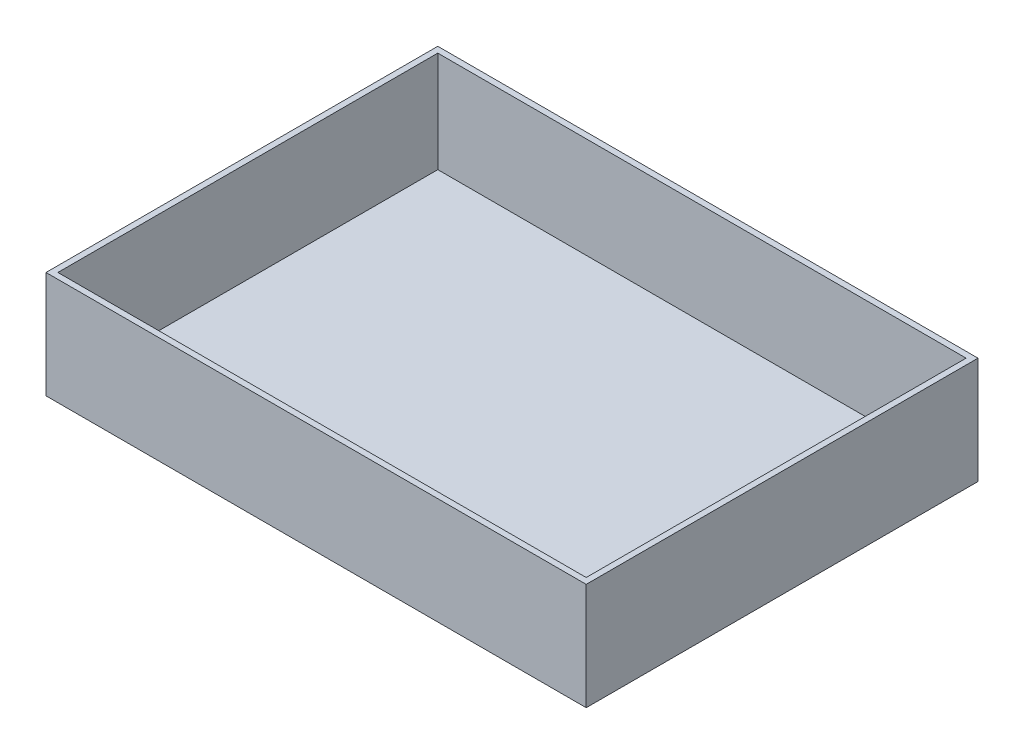
ISO-10303-21;
HEADER;
FILE_DESCRIPTION(('STEP AP214'),'2;1');
FILE_NAME('part.step','',(''),(''),'','','');
FILE_SCHEMA(('AUTOMOTIVE_DESIGN { 1 0 10303 214 1 1 1 1 }'));
ENDSEC;
DATA;
#1=APPLICATION_CONTEXT('core data for automotive mechanical design processes');
#2=APPLICATION_PROTOCOL_DEFINITION('international standard','automotive_design',2000,#1);
#3=PRODUCT_CONTEXT('',#1,'mechanical');
#4=PRODUCT('Part','Part','',(#3));
#5=PRODUCT_RELATED_PRODUCT_CATEGORY('part','',(#4));
#6=PRODUCT_DEFINITION_FORMATION('','',#4);
#7=PRODUCT_DEFINITION_CONTEXT('part definition',#1,'design');
#8=PRODUCT_DEFINITION('design','',#6,#7);
#9=PRODUCT_DEFINITION_SHAPE('','',#8);
#10=(LENGTH_UNIT() NAMED_UNIT(*) SI_UNIT(.MILLI.,.METRE.));
#11=(NAMED_UNIT(*) PLANE_ANGLE_UNIT() SI_UNIT($,.RADIAN.));
#12=(NAMED_UNIT(*) SI_UNIT($,.STERADIAN.) SOLID_ANGLE_UNIT());
#13=UNCERTAINTY_MEASURE_WITH_UNIT(LENGTH_MEASURE(1.E-05),#10,'distance_accuracy_value','');
#14=(GEOMETRIC_REPRESENTATION_CONTEXT(3) GLOBAL_UNCERTAINTY_ASSIGNED_CONTEXT((#13)) GLOBAL_UNIT_ASSIGNED_CONTEXT((#10,
#11,#12)) REPRESENTATION_CONTEXT('',''));
#15=CARTESIAN_POINT('',(0.,0.,0.));
#16=DIRECTION('',(0.,0.,1.));
#17=DIRECTION('',(1.,0.,0.));
#18=AXIS2_PLACEMENT_3D('',#15,#16,#17);
#19=CARTESIAN_POINT('',(0.,45.,0.));
#20=DIRECTION('',(0.,-1.,0.));
#21=DIRECTION('',(0.,0.,-1.));
#22=AXIS2_PLACEMENT_3D('',#19,#20,#21);
#23=PLANE('',#22);
#24=DIRECTION('',(0.,0.,1.));
#25=VECTOR('',#24,1.);
#26=CARTESIAN_POINT('',(-227.5,45.,-165.));
#27=LINE('',#26,#25);
#28=CARTESIAN_POINT('',(-227.5,45.,-165.));
#29=VERTEX_POINT('',#28);
#30=CARTESIAN_POINT('',(-227.5,45.,165.));
#31=VERTEX_POINT('',#30);
#32=EDGE_CURVE('E116',#29,#31,#27,.T.);
#33=ORIENTED_EDGE('',*,*,#32,.T.);
#34=DIRECTION('',(1.,0.,0.));
#35=VECTOR('',#34,1.);
#36=CARTESIAN_POINT('',(227.5,45.,165.));
#37=LINE('',#36,#35);
#38=CARTESIAN_POINT('',(227.5,45.,165.));
#39=VERTEX_POINT('',#38);
#40=EDGE_CURVE('E159',#31,#39,#37,.T.);
#41=ORIENTED_EDGE('',*,*,#40,.T.);
#42=DIRECTION('',(0.,0.,-1.));
#43=VECTOR('',#42,1.);
#44=CARTESIAN_POINT('',(227.5,45.,-165.));
#45=LINE('',#44,#43);
#46=CARTESIAN_POINT('',(227.5,45.,-165.));
#47=VERTEX_POINT('',#46);
#48=EDGE_CURVE('E162',#39,#47,#45,.T.);
#49=ORIENTED_EDGE('',*,*,#48,.T.);
#50=DIRECTION('',(-1.,0.,0.));
#51=VECTOR('',#50,1.);
#52=CARTESIAN_POINT('',(227.5,45.,-165.));
#53=LINE('',#52,#51);
#54=EDGE_CURVE('E150',#47,#29,#53,.T.);
#55=ORIENTED_EDGE('',*,*,#54,.T.);
#56=EDGE_LOOP('',(#33,#41,#49,#55));
#57=FACE_BOUND('',#56,.T.);
#58=DIRECTION('',(0.,0.,1.));
#59=VECTOR('',#58,1.);
#60=CARTESIAN_POINT('',(-222.5,45.,-165.));
#61=LINE('',#60,#59);
#62=CARTESIAN_POINT('',(-222.5,45.,-160.));
#63=VERTEX_POINT('',#62);
#64=CARTESIAN_POINT('',(-222.5,45.,160.));
#65=VERTEX_POINT('',#64);
#66=EDGE_CURVE('E140',#63,#65,#61,.T.);
#67=ORIENTED_EDGE('',*,*,#66,.F.);
#68=DIRECTION('',(-1.,0.,0.));
#69=VECTOR('',#68,1.);
#70=CARTESIAN_POINT('',(227.5,45.,-160.));
#71=LINE('',#70,#69);
#72=CARTESIAN_POINT('',(222.5,45.,-160.));
#73=VERTEX_POINT('',#72);
#74=EDGE_CURVE('E112',#73,#63,#71,.T.);
#75=ORIENTED_EDGE('',*,*,#74,.F.);
#76=DIRECTION('',(0.,0.,-1.));
#77=VECTOR('',#76,1.);
#78=CARTESIAN_POINT('',(222.5,45.,-165.));
#79=LINE('',#78,#77);
#80=CARTESIAN_POINT('',(222.5,45.,160.));
#81=VERTEX_POINT('',#80);
#82=EDGE_CURVE('E50',#81,#73,#79,.T.);
#83=ORIENTED_EDGE('',*,*,#82,.F.);
#84=DIRECTION('',(1.,0.,0.));
#85=VECTOR('',#84,1.);
#86=CARTESIAN_POINT('',(227.5,45.,160.));
#87=LINE('',#86,#85);
#88=EDGE_CURVE('E142',#65,#81,#87,.T.);
#89=ORIENTED_EDGE('',*,*,#88,.F.);
#90=EDGE_LOOP('',(#67,#75,#83,#89));
#91=FACE_BOUND('',#90,.T.);
#92=ADVANCED_FACE('F33',(#57,#91),#23,.F.);
#93=CARTESIAN_POINT('',(-227.5,-45.,-165.));
#94=DIRECTION('',(-1.,0.,0.));
#95=DIRECTION('',(0.,0.,1.));
#96=AXIS2_PLACEMENT_3D('',#93,#94,#95);
#97=PLANE('',#96);
#98=ORIENTED_EDGE('',*,*,#32,.F.);
#99=DIRECTION('',(0.,1.,0.));
#100=VECTOR('',#99,1.);
#101=CARTESIAN_POINT('',(-227.5,-45.,-165.));
#102=LINE('',#101,#100);
#103=CARTESIAN_POINT('',(-227.5,-45.,-165.));
#104=VERTEX_POINT('',#103);
#105=EDGE_CURVE('E11',#104,#29,#102,.T.);
#106=ORIENTED_EDGE('',*,*,#105,.F.);
#107=DIRECTION('',(0.,0.,1.));
#108=VECTOR('',#107,1.);
#109=CARTESIAN_POINT('',(-227.5,-45.,-165.));
#110=LINE('',#109,#108);
#111=CARTESIAN_POINT('',(-227.5,-45.,165.));
#112=VERTEX_POINT('',#111);
#113=EDGE_CURVE('E147',#104,#112,#110,.T.);
#114=ORIENTED_EDGE('',*,*,#113,.T.);
#115=DIRECTION('',(0.,1.,0.));
#116=VECTOR('',#115,1.);
#117=CARTESIAN_POINT('',(-227.5,-45.,165.));
#118=LINE('',#117,#116);
#119=EDGE_CURVE('E37',#112,#31,#118,.T.);
#120=ORIENTED_EDGE('',*,*,#119,.T.);
#121=EDGE_LOOP('',(#98,#106,#114,#120));
#122=FACE_BOUND('',#121,.T.);
#123=ADVANCED_FACE('F35',(#122),#97,.T.);
#124=CARTESIAN_POINT('',(227.5,-45.,-165.));
#125=DIRECTION('',(0.,0.,-1.));
#126=DIRECTION('',(-1.,0.,0.));
#127=AXIS2_PLACEMENT_3D('',#124,#125,#126);
#128=PLANE('',#127);
#129=ORIENTED_EDGE('',*,*,#54,.F.);
#130=DIRECTION('',(0.,1.,0.));
#131=VECTOR('',#130,1.);
#132=CARTESIAN_POINT('',(227.5,-45.,-165.));
#133=LINE('',#132,#131);
#134=CARTESIAN_POINT('',(227.5,-45.,-165.));
#135=VERTEX_POINT('',#134);
#136=EDGE_CURVE('E42',#135,#47,#133,.T.);
#137=ORIENTED_EDGE('',*,*,#136,.F.);
#138=DIRECTION('',(-1.,0.,0.));
#139=VECTOR('',#138,1.);
#140=CARTESIAN_POINT('',(227.5,-45.,-165.));
#141=LINE('',#140,#139);
#142=EDGE_CURVE('E155',#135,#104,#141,.T.);
#143=ORIENTED_EDGE('',*,*,#142,.T.);
#144=ORIENTED_EDGE('',*,*,#105,.T.);
#145=EDGE_LOOP('',(#129,#137,#143,#144));
#146=FACE_BOUND('',#145,.T.);
#147=ADVANCED_FACE('F172',(#146),#128,.T.);
#148=CARTESIAN_POINT('',(227.5,-45.,-165.));
#149=DIRECTION('',(1.,0.,0.));
#150=DIRECTION('',(0.,0.,-1.));
#151=AXIS2_PLACEMENT_3D('',#148,#149,#150);
#152=PLANE('',#151);
#153=ORIENTED_EDGE('',*,*,#48,.F.);
#154=DIRECTION('',(0.,1.,0.));
#155=VECTOR('',#154,1.);
#156=CARTESIAN_POINT('',(227.5,-45.,165.));
#157=LINE('',#156,#155);
#158=CARTESIAN_POINT('',(227.5,-45.,165.));
#159=VERTEX_POINT('',#158);
#160=EDGE_CURVE('E167',#159,#39,#157,.T.);
#161=ORIENTED_EDGE('',*,*,#160,.F.);
#162=DIRECTION('',(0.,0.,-1.));
#163=VECTOR('',#162,1.);
#164=CARTESIAN_POINT('',(227.5,-45.,-165.));
#165=LINE('',#164,#163);
#166=EDGE_CURVE('E152',#159,#135,#165,.T.);
#167=ORIENTED_EDGE('',*,*,#166,.T.);
#168=ORIENTED_EDGE('',*,*,#136,.T.);
#169=EDGE_LOOP('',(#153,#161,#167,#168));
#170=FACE_BOUND('',#169,.T.);
#171=ADVANCED_FACE('F176',(#170),#152,.T.);
#172=CARTESIAN_POINT('',(227.5,-45.,165.));
#173=DIRECTION('',(0.,0.,1.));
#174=DIRECTION('',(1.,0.,0.));
#175=AXIS2_PLACEMENT_3D('',#172,#173,#174);
#176=PLANE('',#175);
#177=ORIENTED_EDGE('',*,*,#40,.F.);
#178=ORIENTED_EDGE('',*,*,#119,.F.);
#179=DIRECTION('',(1.,0.,0.));
#180=VECTOR('',#179,1.);
#181=CARTESIAN_POINT('',(227.5,-45.,165.));
#182=LINE('',#181,#180);
#183=EDGE_CURVE('E149',#112,#159,#182,.T.);
#184=ORIENTED_EDGE('',*,*,#183,.T.);
#185=ORIENTED_EDGE('',*,*,#160,.T.);
#186=EDGE_LOOP('',(#177,#178,#184,#185));
#187=FACE_BOUND('',#186,.T.);
#188=ADVANCED_FACE('F169',(#187),#176,.T.);
#189=CARTESIAN_POINT('',(0.,-45.,0.));
#190=DIRECTION('',(0.,-1.,0.));
#191=DIRECTION('',(0.,0.,-1.));
#192=AXIS2_PLACEMENT_3D('',#189,#190,#191);
#193=PLANE('',#192);
#194=ORIENTED_EDGE('',*,*,#113,.F.);
#195=ORIENTED_EDGE('',*,*,#142,.F.);
#196=ORIENTED_EDGE('',*,*,#166,.F.);
#197=ORIENTED_EDGE('',*,*,#183,.F.);
#198=EDGE_LOOP('',(#194,#195,#196,#197));
#199=FACE_BOUND('',#198,.T.);
#200=ADVANCED_FACE('F178',(#199),#193,.T.);
#201=CARTESIAN_POINT('',(-222.5,-45.,-165.));
#202=DIRECTION('',(-1.,0.,0.));
#203=DIRECTION('',(0.,0.,1.));
#204=AXIS2_PLACEMENT_3D('',#201,#202,#203);
#205=PLANE('',#204);
#206=ORIENTED_EDGE('',*,*,#66,.T.);
#207=DIRECTION('',(0.,1.,0.));
#208=VECTOR('',#207,1.);
#209=CARTESIAN_POINT('',(-222.5,-45.,160.));
#210=LINE('',#209,#208);
#211=CARTESIAN_POINT('',(-222.5,-40.,160.));
#212=VERTEX_POINT('',#211);
#213=EDGE_CURVE('E122',#212,#65,#210,.T.);
#214=ORIENTED_EDGE('',*,*,#213,.F.);
#215=DIRECTION('',(0.,0.,1.));
#216=VECTOR('',#215,1.);
#217=CARTESIAN_POINT('',(-222.5,-40.,-165.));
#218=LINE('',#217,#216);
#219=CARTESIAN_POINT('',(-222.5,-40.,-160.));
#220=VERTEX_POINT('',#219);
#221=EDGE_CURVE('E120',#220,#212,#218,.T.);
#222=ORIENTED_EDGE('',*,*,#221,.F.);
#223=DIRECTION('',(0.,1.,0.));
#224=VECTOR('',#223,1.);
#225=CARTESIAN_POINT('',(-222.5,-45.,-160.));
#226=LINE('',#225,#224);
#227=EDGE_CURVE('E106',#220,#63,#226,.T.);
#228=ORIENTED_EDGE('',*,*,#227,.T.);
#229=EDGE_LOOP('',(#206,#214,#222,#228));
#230=FACE_BOUND('',#229,.T.);
#231=ADVANCED_FACE('F121',(#230),#205,.F.);
#232=CARTESIAN_POINT('',(227.5,-45.,-160.));
#233=DIRECTION('',(0.,0.,-1.));
#234=DIRECTION('',(-1.,0.,0.));
#235=AXIS2_PLACEMENT_3D('',#232,#233,#234);
#236=PLANE('',#235);
#237=ORIENTED_EDGE('',*,*,#74,.T.);
#238=ORIENTED_EDGE('',*,*,#227,.F.);
#239=DIRECTION('',(-1.,0.,0.));
#240=VECTOR('',#239,1.);
#241=CARTESIAN_POINT('',(227.5,-40.,-160.));
#242=LINE('',#241,#240);
#243=CARTESIAN_POINT('',(222.5,-40.,-160.));
#244=VERTEX_POINT('',#243);
#245=EDGE_CURVE('E110',#244,#220,#242,.T.);
#246=ORIENTED_EDGE('',*,*,#245,.F.);
#247=DIRECTION('',(0.,1.,0.));
#248=VECTOR('',#247,1.);
#249=CARTESIAN_POINT('',(222.5,-45.,-160.));
#250=LINE('',#249,#248);
#251=EDGE_CURVE('E117',#244,#73,#250,.T.);
#252=ORIENTED_EDGE('',*,*,#251,.T.);
#253=EDGE_LOOP('',(#237,#238,#246,#252));
#254=FACE_BOUND('',#253,.T.);
#255=ADVANCED_FACE('F108',(#254),#236,.F.);
#256=CARTESIAN_POINT('',(222.5,-45.,-165.));
#257=DIRECTION('',(1.,0.,0.));
#258=DIRECTION('',(0.,0.,-1.));
#259=AXIS2_PLACEMENT_3D('',#256,#257,#258);
#260=PLANE('',#259);
#261=ORIENTED_EDGE('',*,*,#82,.T.);
#262=ORIENTED_EDGE('',*,*,#251,.F.);
#263=DIRECTION('',(0.,0.,-1.));
#264=VECTOR('',#263,1.);
#265=CARTESIAN_POINT('',(222.5,-40.,-165.));
#266=LINE('',#265,#264);
#267=CARTESIAN_POINT('',(222.5,-40.,160.));
#268=VERTEX_POINT('',#267);
#269=EDGE_CURVE('E131',#268,#244,#266,.T.);
#270=ORIENTED_EDGE('',*,*,#269,.F.);
#271=DIRECTION('',(0.,1.,0.));
#272=VECTOR('',#271,1.);
#273=CARTESIAN_POINT('',(222.5,-45.,160.));
#274=LINE('',#273,#272);
#275=EDGE_CURVE('E133',#268,#81,#274,.T.);
#276=ORIENTED_EDGE('',*,*,#275,.T.);
#277=EDGE_LOOP('',(#261,#262,#270,#276));
#278=FACE_BOUND('',#277,.T.);
#279=ADVANCED_FACE('F227',(#278),#260,.F.);
#280=CARTESIAN_POINT('',(227.5,-45.,160.));
#281=DIRECTION('',(0.,0.,1.));
#282=DIRECTION('',(1.,0.,0.));
#283=AXIS2_PLACEMENT_3D('',#280,#281,#282);
#284=PLANE('',#283);
#285=ORIENTED_EDGE('',*,*,#88,.T.);
#286=ORIENTED_EDGE('',*,*,#275,.F.);
#287=DIRECTION('',(1.,0.,0.));
#288=VECTOR('',#287,1.);
#289=CARTESIAN_POINT('',(227.5,-40.,160.));
#290=LINE('',#289,#288);
#291=EDGE_CURVE('E126',#212,#268,#290,.T.);
#292=ORIENTED_EDGE('',*,*,#291,.F.);
#293=ORIENTED_EDGE('',*,*,#213,.T.);
#294=EDGE_LOOP('',(#285,#286,#292,#293));
#295=FACE_BOUND('',#294,.T.);
#296=ADVANCED_FACE('F236',(#295),#284,.F.);
#297=CARTESIAN_POINT('',(0.,-40.,0.));
#298=DIRECTION('',(0.,-1.,0.));
#299=DIRECTION('',(0.,0.,-1.));
#300=AXIS2_PLACEMENT_3D('',#297,#298,#299);
#301=PLANE('',#300);
#302=ORIENTED_EDGE('',*,*,#221,.T.);
#303=ORIENTED_EDGE('',*,*,#291,.T.);
#304=ORIENTED_EDGE('',*,*,#269,.T.);
#305=ORIENTED_EDGE('',*,*,#245,.T.);
#306=EDGE_LOOP('',(#302,#303,#304,#305));
#307=FACE_BOUND('',#306,.T.);
#308=ADVANCED_FACE('F129',(#307),#301,.F.);
#309=CLOSED_SHELL('',(#92,#123,#147,#171,#188,#200,#231,#255,#279,#296,#308));
#310=MANIFOLD_SOLID_BREP('B2',#309);
#311=ADVANCED_BREP_SHAPE_REPRESENTATION('',(#18,#310),#14);
#312=SHAPE_DEFINITION_REPRESENTATION(#9,#311);
ENDSEC;
END-ISO-10303-21;
